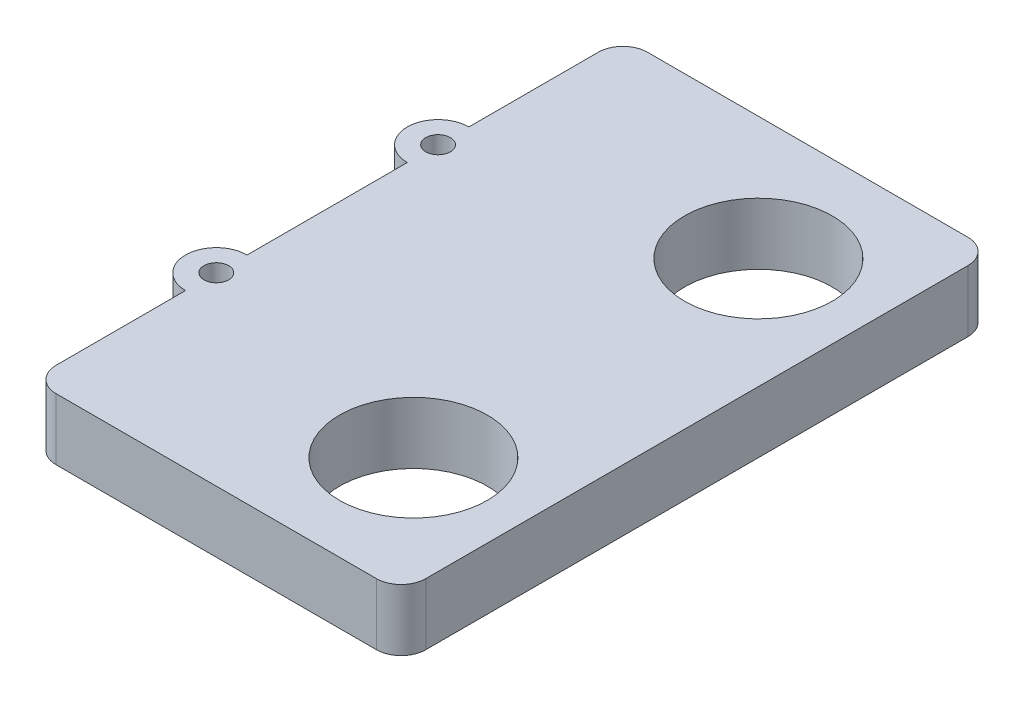
ISO-10303-21;
HEADER;
FILE_DESCRIPTION(('STEP AP214'),'2;1');
FILE_NAME('part.step','',(''),(''),'','','');
FILE_SCHEMA(('AUTOMOTIVE_DESIGN { 1 0 10303 214 1 1 1 1 }'));
ENDSEC;
DATA;
#1=APPLICATION_CONTEXT('core data for automotive mechanical design processes');
#2=APPLICATION_PROTOCOL_DEFINITION('international standard','automotive_design',2000,#1);
#3=PRODUCT_CONTEXT('',#1,'mechanical');
#4=PRODUCT('Part','Part','',(#3));
#5=PRODUCT_RELATED_PRODUCT_CATEGORY('part','',(#4));
#6=PRODUCT_DEFINITION_FORMATION('','',#4);
#7=PRODUCT_DEFINITION_CONTEXT('part definition',#1,'design');
#8=PRODUCT_DEFINITION('design','',#6,#7);
#9=PRODUCT_DEFINITION_SHAPE('','',#8);
#10=(LENGTH_UNIT() NAMED_UNIT(*) SI_UNIT(.MILLI.,.METRE.));
#11=(NAMED_UNIT(*) PLANE_ANGLE_UNIT() SI_UNIT($,.RADIAN.));
#12=(NAMED_UNIT(*) SI_UNIT($,.STERADIAN.) SOLID_ANGLE_UNIT());
#13=UNCERTAINTY_MEASURE_WITH_UNIT(LENGTH_MEASURE(1.E-05),#10,'distance_accuracy_value','');
#14=(GEOMETRIC_REPRESENTATION_CONTEXT(3) GLOBAL_UNCERTAINTY_ASSIGNED_CONTEXT((#13)) GLOBAL_UNIT_ASSIGNED_CONTEXT((#10,
#11,#12)) REPRESENTATION_CONTEXT('',''));
#15=CARTESIAN_POINT('',(0.,0.,0.));
#16=DIRECTION('',(0.,0.,1.));
#17=DIRECTION('',(1.,0.,0.));
#18=AXIS2_PLACEMENT_3D('',#15,#16,#17);
#19=CARTESIAN_POINT('',(0.,5.,-33.));
#20=DIRECTION('',(0.,1.,0.));
#21=DIRECTION('',(0.,0.,1.));
#22=AXIS2_PLACEMENT_3D('',#19,#20,#21);
#23=PLANE('',#22);
#24=CARTESIAN_POINT('',(21.,5.,-38.));
#25=DIRECTION('',(0.,1.,0.));
#26=DIRECTION('',(0.,0.,1.));
#27=AXIS2_PLACEMENT_3D('',#24,#25,#26);
#28=CIRCLE('',#27,6.00000000000001);
#29=CARTESIAN_POINT('',(21.,5.,-32.));
#30=VERTEX_POINT('',#29);
#31=EDGE_CURVE('E302',#30,#30,#28,.T.);
#32=ORIENTED_EDGE('',*,*,#31,.F.);
#33=EDGE_LOOP('',(#32));
#34=FACE_BOUND('',#33,.T.);
#35=CARTESIAN_POINT('',(0.,5.,-33.));
#36=DIRECTION('',(0.,1.,0.));
#37=DIRECTION('',(0.,0.,1.));
#38=AXIS2_PLACEMENT_3D('',#35,#36,#37);
#39=CIRCLE('',#38,1.);
#40=CARTESIAN_POINT('',(0.,5.,-32.));
#41=VERTEX_POINT('',#40);
#42=EDGE_CURVE('E161',#41,#41,#39,.T.);
#43=ORIENTED_EDGE('',*,*,#42,.F.);
#44=EDGE_LOOP('',(#43));
#45=FACE_BOUND('',#44,.T.);
#46=DIRECTION('',(0.,0.,1.));
#47=VECTOR('',#46,1.);
#48=CARTESIAN_POINT('',(0.,5.,0.));
#49=LINE('',#48,#47);
#50=CARTESIAN_POINT('',(0.,5.,-12.5));
#51=VERTEX_POINT('',#50);
#52=CARTESIAN_POINT('',(0.,5.,-2.));
#53=VERTEX_POINT('',#52);
#54=EDGE_CURVE('E151',#51,#53,#49,.T.);
#55=ORIENTED_EDGE('',*,*,#54,.T.);
#56=CARTESIAN_POINT('',(2.,5.,-2.));
#57=DIRECTION('',(0.,1.,0.));
#58=DIRECTION('',(0.,0.,1.));
#59=AXIS2_PLACEMENT_3D('',#56,#57,#58);
#60=CIRCLE('',#59,2.);
#61=CARTESIAN_POINT('',(2.,5.,0.));
#62=VERTEX_POINT('',#61);
#63=EDGE_CURVE('E202',#53,#62,#60,.T.);
#64=ORIENTED_EDGE('',*,*,#63,.T.);
#65=DIRECTION('',(1.,0.,0.));
#66=VECTOR('',#65,1.);
#67=CARTESIAN_POINT('',(0.,5.,0.));
#68=LINE('',#67,#66);
#69=CARTESIAN_POINT('',(28.,5.,0.));
#70=VERTEX_POINT('',#69);
#71=EDGE_CURVE('E153',#62,#70,#68,.T.);
#72=ORIENTED_EDGE('',*,*,#71,.T.);
#73=CARTESIAN_POINT('',(28.,5.,-2.));
#74=DIRECTION('',(0.,1.,0.));
#75=DIRECTION('',(0.,0.,1.));
#76=AXIS2_PLACEMENT_3D('',#73,#74,#75);
#77=CIRCLE('',#76,2.);
#78=CARTESIAN_POINT('',(30.,5.,-2.));
#79=VERTEX_POINT('',#78);
#80=EDGE_CURVE('E200',#70,#79,#77,.T.);
#81=ORIENTED_EDGE('',*,*,#80,.T.);
#82=DIRECTION('',(0.,0.,-1.));
#83=VECTOR('',#82,1.);
#84=CARTESIAN_POINT('',(30.,5.,0.));
#85=LINE('',#84,#83);
#86=CARTESIAN_POINT('',(30.,5.,-46.));
#87=VERTEX_POINT('',#86);
#88=EDGE_CURVE('E176',#79,#87,#85,.T.);
#89=ORIENTED_EDGE('',*,*,#88,.T.);
#90=CARTESIAN_POINT('',(28.,5.,-46.));
#91=DIRECTION('',(0.,1.,0.));
#92=DIRECTION('',(0.,0.,1.));
#93=AXIS2_PLACEMENT_3D('',#90,#91,#92);
#94=CIRCLE('',#93,2.);
#95=CARTESIAN_POINT('',(28.,5.,-48.));
#96=VERTEX_POINT('',#95);
#97=EDGE_CURVE('E197',#87,#96,#94,.T.);
#98=ORIENTED_EDGE('',*,*,#97,.T.);
#99=DIRECTION('',(-1.,0.,0.));
#100=VECTOR('',#99,1.);
#101=CARTESIAN_POINT('',(0.,5.,-48.));
#102=LINE('',#101,#100);
#103=CARTESIAN_POINT('',(2.,5.,-48.));
#104=VERTEX_POINT('',#103);
#105=EDGE_CURVE('E129',#96,#104,#102,.T.);
#106=ORIENTED_EDGE('',*,*,#105,.T.);
#107=CARTESIAN_POINT('',(2.,5.,-46.));
#108=DIRECTION('',(0.,1.,0.));
#109=DIRECTION('',(0.,0.,1.));
#110=AXIS2_PLACEMENT_3D('',#107,#108,#109);
#111=CIRCLE('',#110,2.);
#112=CARTESIAN_POINT('',(0.,5.,-46.));
#113=VERTEX_POINT('',#112);
#114=EDGE_CURVE('E48',#104,#113,#111,.T.);
#115=ORIENTED_EDGE('',*,*,#114,.T.);
#116=DIRECTION('',(0.,0.,1.));
#117=VECTOR('',#116,1.);
#118=CARTESIAN_POINT('',(0.,5.,-35.5));
#119=LINE('',#118,#117);
#120=CARTESIAN_POINT('',(0.,5.,-35.5));
#121=VERTEX_POINT('',#120);
#122=EDGE_CURVE('E119',#113,#121,#119,.T.);
#123=ORIENTED_EDGE('',*,*,#122,.T.);
#124=CARTESIAN_POINT('',(0.,5.,-33.));
#125=DIRECTION('',(0.,1.,0.));
#126=DIRECTION('',(0.,0.,1.));
#127=AXIS2_PLACEMENT_3D('',#124,#125,#126);
#128=CIRCLE('',#127,2.5);
#129=CARTESIAN_POINT('',(0.,5.,-30.5));
#130=VERTEX_POINT('',#129);
#131=EDGE_CURVE('E124',#121,#130,#128,.T.);
#132=ORIENTED_EDGE('',*,*,#131,.T.);
#133=DIRECTION('',(0.,0.,1.));
#134=VECTOR('',#133,1.);
#135=CARTESIAN_POINT('',(0.,5.,-17.5));
#136=LINE('',#135,#134);
#137=CARTESIAN_POINT('',(0.,5.,-17.5));
#138=VERTEX_POINT('',#137);
#139=EDGE_CURVE('E144',#130,#138,#136,.T.);
#140=ORIENTED_EDGE('',*,*,#139,.T.);
#141=CARTESIAN_POINT('',(0.,5.,-15.));
#142=DIRECTION('',(0.,1.,0.));
#143=DIRECTION('',(0.,0.,1.));
#144=AXIS2_PLACEMENT_3D('',#141,#142,#143);
#145=CIRCLE('',#144,2.5);
#146=EDGE_CURVE('E146',#138,#51,#145,.T.);
#147=ORIENTED_EDGE('',*,*,#146,.T.);
#148=EDGE_LOOP('',(#55,#64,#72,#81,#89,#98,#106,#115,#123,#132,#140,#147));
#149=FACE_BOUND('',#148,.T.);
#150=CARTESIAN_POINT('',(0.,5.,-15.));
#151=DIRECTION('',(0.,1.,0.));
#152=DIRECTION('',(0.,0.,1.));
#153=AXIS2_PLACEMENT_3D('',#150,#151,#152);
#154=CIRCLE('',#153,1.);
#155=CARTESIAN_POINT('',(0.,5.,-14.));
#156=VERTEX_POINT('',#155);
#157=EDGE_CURVE('E296',#156,#156,#154,.T.);
#158=ORIENTED_EDGE('',*,*,#157,.F.);
#159=EDGE_LOOP('',(#158));
#160=FACE_BOUND('',#159,.T.);
#161=CARTESIAN_POINT('',(21.,5.,-10.));
#162=DIRECTION('',(0.,1.,0.));
#163=DIRECTION('',(0.,0.,1.));
#164=AXIS2_PLACEMENT_3D('',#161,#162,#163);
#165=CIRCLE('',#164,6.);
#166=CARTESIAN_POINT('',(21.,5.,-4.));
#167=VERTEX_POINT('',#166);
#168=EDGE_CURVE('E308',#167,#167,#165,.T.);
#169=ORIENTED_EDGE('',*,*,#168,.F.);
#170=EDGE_LOOP('',(#169));
#171=FACE_BOUND('',#170,.T.);
#172=ADVANCED_FACE('F33',(#34,#45,#149,#160,#171),#23,.T.);
#173=CARTESIAN_POINT('',(0.,0.,-33.));
#174=DIRECTION('',(0.,1.,0.));
#175=DIRECTION('',(0.,0.,1.));
#176=AXIS2_PLACEMENT_3D('',#173,#174,#175);
#177=PLANE('',#176);
#178=DIRECTION('',(1.,0.,0.));
#179=VECTOR('',#178,1.);
#180=CARTESIAN_POINT('',(0.,0.,0.));
#181=LINE('',#180,#179);
#182=CARTESIAN_POINT('',(2.,0.,0.));
#183=VERTEX_POINT('',#182);
#184=CARTESIAN_POINT('',(28.,0.,0.));
#185=VERTEX_POINT('',#184);
#186=EDGE_CURVE('E173',#183,#185,#181,.T.);
#187=ORIENTED_EDGE('',*,*,#186,.F.);
#188=CARTESIAN_POINT('',(2.,0.,-2.));
#189=DIRECTION('',(0.,1.,0.));
#190=DIRECTION('',(0.,0.,1.));
#191=AXIS2_PLACEMENT_3D('',#188,#189,#190);
#192=CIRCLE('',#191,2.);
#193=CARTESIAN_POINT('',(0.,0.,-2.));
#194=VERTEX_POINT('',#193);
#195=EDGE_CURVE('E193',#183,#194,#192,.F.);
#196=ORIENTED_EDGE('',*,*,#195,.T.);
#197=DIRECTION('',(0.,0.,1.));
#198=VECTOR('',#197,1.);
#199=CARTESIAN_POINT('',(0.,0.,0.));
#200=LINE('',#199,#198);
#201=CARTESIAN_POINT('',(0.,0.,-12.5));
#202=VERTEX_POINT('',#201);
#203=EDGE_CURVE('E170',#202,#194,#200,.T.);
#204=ORIENTED_EDGE('',*,*,#203,.F.);
#205=CARTESIAN_POINT('',(0.,0.,-15.));
#206=DIRECTION('',(0.,1.,0.));
#207=DIRECTION('',(0.,0.,1.));
#208=AXIS2_PLACEMENT_3D('',#205,#206,#207);
#209=CIRCLE('',#208,2.5);
#210=CARTESIAN_POINT('',(0.,0.,-17.5));
#211=VERTEX_POINT('',#210);
#212=EDGE_CURVE('E168',#211,#202,#209,.T.);
#213=ORIENTED_EDGE('',*,*,#212,.F.);
#214=DIRECTION('',(0.,0.,1.));
#215=VECTOR('',#214,1.);
#216=CARTESIAN_POINT('',(0.,0.,-17.5));
#217=LINE('',#216,#215);
#218=CARTESIAN_POINT('',(0.,0.,-30.5));
#219=VERTEX_POINT('',#218);
#220=EDGE_CURVE('E166',#219,#211,#217,.T.);
#221=ORIENTED_EDGE('',*,*,#220,.F.);
#222=CARTESIAN_POINT('',(0.,0.,-33.));
#223=DIRECTION('',(0.,1.,0.));
#224=DIRECTION('',(0.,0.,1.));
#225=AXIS2_PLACEMENT_3D('',#222,#223,#224);
#226=CIRCLE('',#225,2.5);
#227=CARTESIAN_POINT('',(0.,0.,-35.5));
#228=VERTEX_POINT('',#227);
#229=EDGE_CURVE('E164',#228,#219,#226,.T.);
#230=ORIENTED_EDGE('',*,*,#229,.F.);
#231=DIRECTION('',(0.,0.,1.));
#232=VECTOR('',#231,1.);
#233=CARTESIAN_POINT('',(0.,0.,-35.5));
#234=LINE('',#233,#232);
#235=CARTESIAN_POINT('',(0.,0.,-46.));
#236=VERTEX_POINT('',#235);
#237=EDGE_CURVE('E135',#236,#228,#234,.T.);
#238=ORIENTED_EDGE('',*,*,#237,.F.);
#239=CARTESIAN_POINT('',(2.,0.,-46.));
#240=DIRECTION('',(0.,1.,0.));
#241=DIRECTION('',(0.,0.,1.));
#242=AXIS2_PLACEMENT_3D('',#239,#240,#241);
#243=CIRCLE('',#242,2.);
#244=CARTESIAN_POINT('',(2.,0.,-48.));
#245=VERTEX_POINT('',#244);
#246=EDGE_CURVE('E189',#236,#245,#243,.F.);
#247=ORIENTED_EDGE('',*,*,#246,.T.);
#248=DIRECTION('',(-1.,0.,0.));
#249=VECTOR('',#248,1.);
#250=CARTESIAN_POINT('',(0.,0.,-48.));
#251=LINE('',#250,#249);
#252=CARTESIAN_POINT('',(28.,0.,-48.));
#253=VERTEX_POINT('',#252);
#254=EDGE_CURVE('E160',#253,#245,#251,.T.);
#255=ORIENTED_EDGE('',*,*,#254,.F.);
#256=CARTESIAN_POINT('',(28.,0.,-46.));
#257=DIRECTION('',(0.,1.,0.));
#258=DIRECTION('',(0.,0.,1.));
#259=AXIS2_PLACEMENT_3D('',#256,#257,#258);
#260=CIRCLE('',#259,2.);
#261=CARTESIAN_POINT('',(30.,0.,-46.));
#262=VERTEX_POINT('',#261);
#263=EDGE_CURVE('E187',#253,#262,#260,.F.);
#264=ORIENTED_EDGE('',*,*,#263,.T.);
#265=DIRECTION('',(0.,0.,-1.));
#266=VECTOR('',#265,1.);
#267=CARTESIAN_POINT('',(30.,0.,0.));
#268=LINE('',#267,#266);
#269=CARTESIAN_POINT('',(30.,0.,-2.));
#270=VERTEX_POINT('',#269);
#271=EDGE_CURVE('E157',#270,#262,#268,.T.);
#272=ORIENTED_EDGE('',*,*,#271,.F.);
#273=CARTESIAN_POINT('',(28.,0.,-2.));
#274=DIRECTION('',(0.,1.,0.));
#275=DIRECTION('',(0.,0.,1.));
#276=AXIS2_PLACEMENT_3D('',#273,#274,#275);
#277=CIRCLE('',#276,2.);
#278=EDGE_CURVE('E191',#270,#185,#277,.F.);
#279=ORIENTED_EDGE('',*,*,#278,.T.);
#280=EDGE_LOOP('',(#187,#196,#204,#213,#221,#230,#238,#247,#255,#264,#272,#279));
#281=FACE_BOUND('',#280,.T.);
#282=CARTESIAN_POINT('',(0.,0.,-33.));
#283=DIRECTION('',(0.,1.,0.));
#284=DIRECTION('',(0.,0.,1.));
#285=AXIS2_PLACEMENT_3D('',#282,#283,#284);
#286=CIRCLE('',#285,1.);
#287=CARTESIAN_POINT('',(0.,0.,-32.));
#288=VERTEX_POINT('',#287);
#289=EDGE_CURVE('E293',#288,#288,#286,.T.);
#290=ORIENTED_EDGE('',*,*,#289,.T.);
#291=EDGE_LOOP('',(#290));
#292=FACE_BOUND('',#291,.T.);
#293=CARTESIAN_POINT('',(0.,0.,-15.));
#294=DIRECTION('',(0.,1.,0.));
#295=DIRECTION('',(0.,0.,1.));
#296=AXIS2_PLACEMENT_3D('',#293,#294,#295);
#297=CIRCLE('',#296,1.);
#298=CARTESIAN_POINT('',(0.,0.,-14.));
#299=VERTEX_POINT('',#298);
#300=EDGE_CURVE('E299',#299,#299,#297,.T.);
#301=ORIENTED_EDGE('',*,*,#300,.T.);
#302=EDGE_LOOP('',(#301));
#303=FACE_BOUND('',#302,.T.);
#304=CARTESIAN_POINT('',(21.,0.,-38.));
#305=DIRECTION('',(0.,1.,0.));
#306=DIRECTION('',(0.,0.,1.));
#307=AXIS2_PLACEMENT_3D('',#304,#305,#306);
#308=CIRCLE('',#307,6.00000000000001);
#309=CARTESIAN_POINT('',(21.,0.,-32.));
#310=VERTEX_POINT('',#309);
#311=EDGE_CURVE('E305',#310,#310,#308,.T.);
#312=ORIENTED_EDGE('',*,*,#311,.T.);
#313=EDGE_LOOP('',(#312));
#314=FACE_BOUND('',#313,.T.);
#315=CARTESIAN_POINT('',(21.,0.,-10.));
#316=DIRECTION('',(0.,1.,0.));
#317=DIRECTION('',(0.,0.,1.));
#318=AXIS2_PLACEMENT_3D('',#315,#316,#317);
#319=CIRCLE('',#318,6.);
#320=CARTESIAN_POINT('',(21.,0.,-4.));
#321=VERTEX_POINT('',#320);
#322=EDGE_CURVE('E311',#321,#321,#319,.T.);
#323=ORIENTED_EDGE('',*,*,#322,.T.);
#324=EDGE_LOOP('',(#323));
#325=FACE_BOUND('',#324,.T.);
#326=ADVANCED_FACE('F218',(#281,#292,#303,#314,#325),#177,.F.);
#327=CARTESIAN_POINT('',(30.,5.,0.));
#328=DIRECTION('',(-1.,0.,0.));
#329=DIRECTION('',(0.,0.,1.));
#330=AXIS2_PLACEMENT_3D('',#327,#328,#329);
#331=PLANE('',#330);
#332=ORIENTED_EDGE('',*,*,#88,.F.);
#333=DIRECTION('',(0.,-1.,0.));
#334=VECTOR('',#333,1.);
#335=CARTESIAN_POINT('',(30.,5.,-2.));
#336=LINE('',#335,#334);
#337=EDGE_CURVE('E206',#79,#270,#336,.T.);
#338=ORIENTED_EDGE('',*,*,#337,.T.);
#339=ORIENTED_EDGE('',*,*,#271,.T.);
#340=DIRECTION('',(0.,-1.,0.));
#341=VECTOR('',#340,1.);
#342=CARTESIAN_POINT('',(30.,5.,-46.));
#343=LINE('',#342,#341);
#344=EDGE_CURVE('E204',#262,#87,#343,.F.);
#345=ORIENTED_EDGE('',*,*,#344,.T.);
#346=EDGE_LOOP('',(#332,#338,#339,#345));
#347=FACE_BOUND('',#346,.T.);
#348=ADVANCED_FACE('F238',(#347),#331,.F.);
#349=CARTESIAN_POINT('',(0.,5.,-48.));
#350=DIRECTION('',(0.,0.,1.));
#351=DIRECTION('',(1.,0.,0.));
#352=AXIS2_PLACEMENT_3D('',#349,#350,#351);
#353=PLANE('',#352);
#354=ORIENTED_EDGE('',*,*,#254,.T.);
#355=DIRECTION('',(0.,-1.,0.));
#356=VECTOR('',#355,1.);
#357=CARTESIAN_POINT('',(2.,5.,-48.));
#358=LINE('',#357,#356);
#359=EDGE_CURVE('E11',#245,#104,#358,.F.);
#360=ORIENTED_EDGE('',*,*,#359,.T.);
#361=ORIENTED_EDGE('',*,*,#105,.F.);
#362=DIRECTION('',(0.,-1.,0.));
#363=VECTOR('',#362,1.);
#364=CARTESIAN_POINT('',(28.,5.,-48.));
#365=LINE('',#364,#363);
#366=EDGE_CURVE('E41',#96,#253,#365,.T.);
#367=ORIENTED_EDGE('',*,*,#366,.T.);
#368=EDGE_LOOP('',(#354,#360,#361,#367));
#369=FACE_BOUND('',#368,.T.);
#370=ADVANCED_FACE('F213',(#369),#353,.F.);
#371=CARTESIAN_POINT('',(0.,5.,-35.5));
#372=DIRECTION('',(1.,0.,0.));
#373=DIRECTION('',(0.,0.,-1.));
#374=AXIS2_PLACEMENT_3D('',#371,#372,#373);
#375=PLANE('',#374);
#376=ORIENTED_EDGE('',*,*,#122,.F.);
#377=DIRECTION('',(0.,-1.,0.));
#378=VECTOR('',#377,1.);
#379=CARTESIAN_POINT('',(0.,5.,-46.));
#380=LINE('',#379,#378);
#381=EDGE_CURVE('E209',#113,#236,#380,.T.);
#382=ORIENTED_EDGE('',*,*,#381,.T.);
#383=ORIENTED_EDGE('',*,*,#237,.T.);
#384=DIRECTION('',(0.,-1.,0.));
#385=VECTOR('',#384,1.);
#386=CARTESIAN_POINT('',(0.,5.,-35.5));
#387=LINE('',#386,#385);
#388=EDGE_CURVE('E132',#121,#228,#387,.T.);
#389=ORIENTED_EDGE('',*,*,#388,.F.);
#390=EDGE_LOOP('',(#376,#382,#383,#389));
#391=FACE_BOUND('',#390,.T.);
#392=ADVANCED_FACE('F133',(#391),#375,.F.);
#393=CARTESIAN_POINT('',(0.,5.,-33.));
#394=DIRECTION('',(0.,-1.,0.));
#395=DIRECTION('',(0.,0.,-1.));
#396=AXIS2_PLACEMENT_3D('',#393,#394,#395);
#397=CYLINDRICAL_SURFACE('',#396,2.5);
#398=ORIENTED_EDGE('',*,*,#229,.T.);
#399=DIRECTION('',(0.,-1.,0.));
#400=VECTOR('',#399,1.);
#401=CARTESIAN_POINT('',(0.,5.,-30.5));
#402=LINE('',#401,#400);
#403=EDGE_CURVE('E139',#130,#219,#402,.T.);
#404=ORIENTED_EDGE('',*,*,#403,.F.);
#405=ORIENTED_EDGE('',*,*,#131,.F.);
#406=ORIENTED_EDGE('',*,*,#388,.T.);
#407=EDGE_LOOP('',(#398,#404,#405,#406));
#408=FACE_BOUND('',#407,.T.);
#409=ADVANCED_FACE('F141',(#408),#397,.T.);
#410=CARTESIAN_POINT('',(0.,5.,-17.5));
#411=DIRECTION('',(1.,0.,0.));
#412=DIRECTION('',(0.,0.,-1.));
#413=AXIS2_PLACEMENT_3D('',#410,#411,#412);
#414=PLANE('',#413);
#415=ORIENTED_EDGE('',*,*,#220,.T.);
#416=DIRECTION('',(0.,-1.,0.));
#417=VECTOR('',#416,1.);
#418=CARTESIAN_POINT('',(0.,5.,-17.5));
#419=LINE('',#418,#417);
#420=EDGE_CURVE('E179',#138,#211,#419,.T.);
#421=ORIENTED_EDGE('',*,*,#420,.F.);
#422=ORIENTED_EDGE('',*,*,#139,.F.);
#423=ORIENTED_EDGE('',*,*,#403,.T.);
#424=EDGE_LOOP('',(#415,#421,#422,#423));
#425=FACE_BOUND('',#424,.T.);
#426=ADVANCED_FACE('F257',(#425),#414,.F.);
#427=CARTESIAN_POINT('',(0.,5.,-15.));
#428=DIRECTION('',(0.,-1.,0.));
#429=DIRECTION('',(0.,0.,-1.));
#430=AXIS2_PLACEMENT_3D('',#427,#428,#429);
#431=CYLINDRICAL_SURFACE('',#430,2.5);
#432=ORIENTED_EDGE('',*,*,#212,.T.);
#433=DIRECTION('',(0.,-1.,0.));
#434=VECTOR('',#433,1.);
#435=CARTESIAN_POINT('',(0.,5.,-12.5));
#436=LINE('',#435,#434);
#437=EDGE_CURVE('E156',#51,#202,#436,.T.);
#438=ORIENTED_EDGE('',*,*,#437,.F.);
#439=ORIENTED_EDGE('',*,*,#146,.F.);
#440=ORIENTED_EDGE('',*,*,#420,.T.);
#441=EDGE_LOOP('',(#432,#438,#439,#440));
#442=FACE_BOUND('',#441,.T.);
#443=ADVANCED_FACE('F253',(#442),#431,.T.);
#444=CARTESIAN_POINT('',(0.,5.,0.));
#445=DIRECTION('',(1.,0.,0.));
#446=DIRECTION('',(0.,0.,-1.));
#447=AXIS2_PLACEMENT_3D('',#444,#445,#446);
#448=PLANE('',#447);
#449=ORIENTED_EDGE('',*,*,#203,.T.);
#450=DIRECTION('',(0.,-1.,0.));
#451=VECTOR('',#450,1.);
#452=CARTESIAN_POINT('',(0.,5.,-2.));
#453=LINE('',#452,#451);
#454=EDGE_CURVE('E195',#194,#53,#453,.F.);
#455=ORIENTED_EDGE('',*,*,#454,.T.);
#456=ORIENTED_EDGE('',*,*,#54,.F.);
#457=ORIENTED_EDGE('',*,*,#437,.T.);
#458=EDGE_LOOP('',(#449,#455,#456,#457));
#459=FACE_BOUND('',#458,.T.);
#460=ADVANCED_FACE('F249',(#459),#448,.F.);
#461=CARTESIAN_POINT('',(0.,5.,0.));
#462=DIRECTION('',(0.,0.,-1.));
#463=DIRECTION('',(-1.,0.,0.));
#464=AXIS2_PLACEMENT_3D('',#461,#462,#463);
#465=PLANE('',#464);
#466=ORIENTED_EDGE('',*,*,#71,.F.);
#467=DIRECTION('',(0.,-1.,0.));
#468=VECTOR('',#467,1.);
#469=CARTESIAN_POINT('',(2.,5.,0.));
#470=LINE('',#469,#468);
#471=EDGE_CURVE('E184',#62,#183,#470,.T.);
#472=ORIENTED_EDGE('',*,*,#471,.T.);
#473=ORIENTED_EDGE('',*,*,#186,.T.);
#474=DIRECTION('',(0.,-1.,0.));
#475=VECTOR('',#474,1.);
#476=CARTESIAN_POINT('',(28.,5.,0.));
#477=LINE('',#476,#475);
#478=EDGE_CURVE('E138',#185,#70,#477,.F.);
#479=ORIENTED_EDGE('',*,*,#478,.T.);
#480=EDGE_LOOP('',(#466,#472,#473,#479));
#481=FACE_BOUND('',#480,.T.);
#482=ADVANCED_FACE('F246',(#481),#465,.F.);
#483=CARTESIAN_POINT('',(0.,5.,-33.));
#484=DIRECTION('',(0.,-1.,0.));
#485=DIRECTION('',(0.,0.,-1.));
#486=AXIS2_PLACEMENT_3D('',#483,#484,#485);
#487=CYLINDRICAL_SURFACE('',#486,1.);
#488=ORIENTED_EDGE('',*,*,#42,.T.);
#489=EDGE_LOOP('',(#488));
#490=FACE_BOUND('',#489,.T.);
#491=ORIENTED_EDGE('',*,*,#289,.F.);
#492=EDGE_LOOP('',(#491));
#493=FACE_BOUND('',#492,.T.);
#494=ADVANCED_FACE('F243',(#490,#493),#487,.F.);
#495=CARTESIAN_POINT('',(0.,5.,-15.));
#496=DIRECTION('',(0.,-1.,0.));
#497=DIRECTION('',(0.,0.,-1.));
#498=AXIS2_PLACEMENT_3D('',#495,#496,#497);
#499=CYLINDRICAL_SURFACE('',#498,1.);
#500=ORIENTED_EDGE('',*,*,#157,.T.);
#501=EDGE_LOOP('',(#500));
#502=FACE_BOUND('',#501,.T.);
#503=ORIENTED_EDGE('',*,*,#300,.F.);
#504=EDGE_LOOP('',(#503));
#505=FACE_BOUND('',#504,.T.);
#506=ADVANCED_FACE('F323',(#502,#505),#499,.F.);
#507=CARTESIAN_POINT('',(21.,5.,-38.));
#508=DIRECTION('',(0.,-1.,0.));
#509=DIRECTION('',(0.,0.,-1.));
#510=AXIS2_PLACEMENT_3D('',#507,#508,#509);
#511=CYLINDRICAL_SURFACE('',#510,6.00000000000001);
#512=ORIENTED_EDGE('',*,*,#31,.T.);
#513=EDGE_LOOP('',(#512));
#514=FACE_BOUND('',#513,.T.);
#515=ORIENTED_EDGE('',*,*,#311,.F.);
#516=EDGE_LOOP('',(#515));
#517=FACE_BOUND('',#516,.T.);
#518=ADVANCED_FACE('F277',(#514,#517),#511,.F.);
#519=CARTESIAN_POINT('',(21.,5.,-10.));
#520=DIRECTION('',(0.,-1.,0.));
#521=DIRECTION('',(0.,0.,-1.));
#522=AXIS2_PLACEMENT_3D('',#519,#520,#521);
#523=CYLINDRICAL_SURFACE('',#522,6.);
#524=ORIENTED_EDGE('',*,*,#168,.T.);
#525=EDGE_LOOP('',(#524));
#526=FACE_BOUND('',#525,.T.);
#527=ORIENTED_EDGE('',*,*,#322,.F.);
#528=EDGE_LOOP('',(#527));
#529=FACE_BOUND('',#528,.T.);
#530=ADVANCED_FACE('F272',(#526,#529),#523,.F.);
#531=CARTESIAN_POINT('',(2.,5.,-2.));
#532=DIRECTION('',(0.,-1.,0.));
#533=DIRECTION('',(0.,0.,-1.));
#534=AXIS2_PLACEMENT_3D('',#531,#532,#533);
#535=CYLINDRICAL_SURFACE('',#534,2.);
#536=ORIENTED_EDGE('',*,*,#63,.F.);
#537=ORIENTED_EDGE('',*,*,#454,.F.);
#538=ORIENTED_EDGE('',*,*,#195,.F.);
#539=ORIENTED_EDGE('',*,*,#471,.F.);
#540=EDGE_LOOP('',(#536,#537,#538,#539));
#541=FACE_BOUND('',#540,.T.);
#542=ADVANCED_FACE('F229',(#541),#535,.T.);
#543=CARTESIAN_POINT('',(28.,5.,-2.));
#544=DIRECTION('',(0.,-1.,0.));
#545=DIRECTION('',(0.,0.,-1.));
#546=AXIS2_PLACEMENT_3D('',#543,#544,#545);
#547=CYLINDRICAL_SURFACE('',#546,2.);
#548=ORIENTED_EDGE('',*,*,#80,.F.);
#549=ORIENTED_EDGE('',*,*,#478,.F.);
#550=ORIENTED_EDGE('',*,*,#278,.F.);
#551=ORIENTED_EDGE('',*,*,#337,.F.);
#552=EDGE_LOOP('',(#548,#549,#550,#551));
#553=FACE_BOUND('',#552,.T.);
#554=ADVANCED_FACE('F224',(#553),#547,.T.);
#555=CARTESIAN_POINT('',(2.,5.,-46.));
#556=DIRECTION('',(0.,-1.,0.));
#557=DIRECTION('',(0.,0.,-1.));
#558=AXIS2_PLACEMENT_3D('',#555,#556,#557);
#559=CYLINDRICAL_SURFACE('',#558,2.);
#560=ORIENTED_EDGE('',*,*,#114,.F.);
#561=ORIENTED_EDGE('',*,*,#359,.F.);
#562=ORIENTED_EDGE('',*,*,#246,.F.);
#563=ORIENTED_EDGE('',*,*,#381,.F.);
#564=EDGE_LOOP('',(#560,#561,#562,#563));
#565=FACE_BOUND('',#564,.T.);
#566=ADVANCED_FACE('F222',(#565),#559,.T.);
#567=CARTESIAN_POINT('',(28.,5.,-46.));
#568=DIRECTION('',(0.,-1.,0.));
#569=DIRECTION('',(0.,0.,-1.));
#570=AXIS2_PLACEMENT_3D('',#567,#568,#569);
#571=CYLINDRICAL_SURFACE('',#570,2.);
#572=ORIENTED_EDGE('',*,*,#97,.F.);
#573=ORIENTED_EDGE('',*,*,#344,.F.);
#574=ORIENTED_EDGE('',*,*,#263,.F.);
#575=ORIENTED_EDGE('',*,*,#366,.F.);
#576=EDGE_LOOP('',(#572,#573,#574,#575));
#577=FACE_BOUND('',#576,.T.);
#578=ADVANCED_FACE('F35',(#577),#571,.T.);
#579=CLOSED_SHELL('',(#172,#326,#348,#370,#392,#409,#426,#443,#460,#482,#494,#506,#518,#530,
#542,#554,#566,#578));
#580=MANIFOLD_SOLID_BREP('B2',#579);
#581=ADVANCED_BREP_SHAPE_REPRESENTATION('',(#18,#580),#14);
#582=SHAPE_DEFINITION_REPRESENTATION(#9,#581);
ENDSEC;
END-ISO-10303-21;
